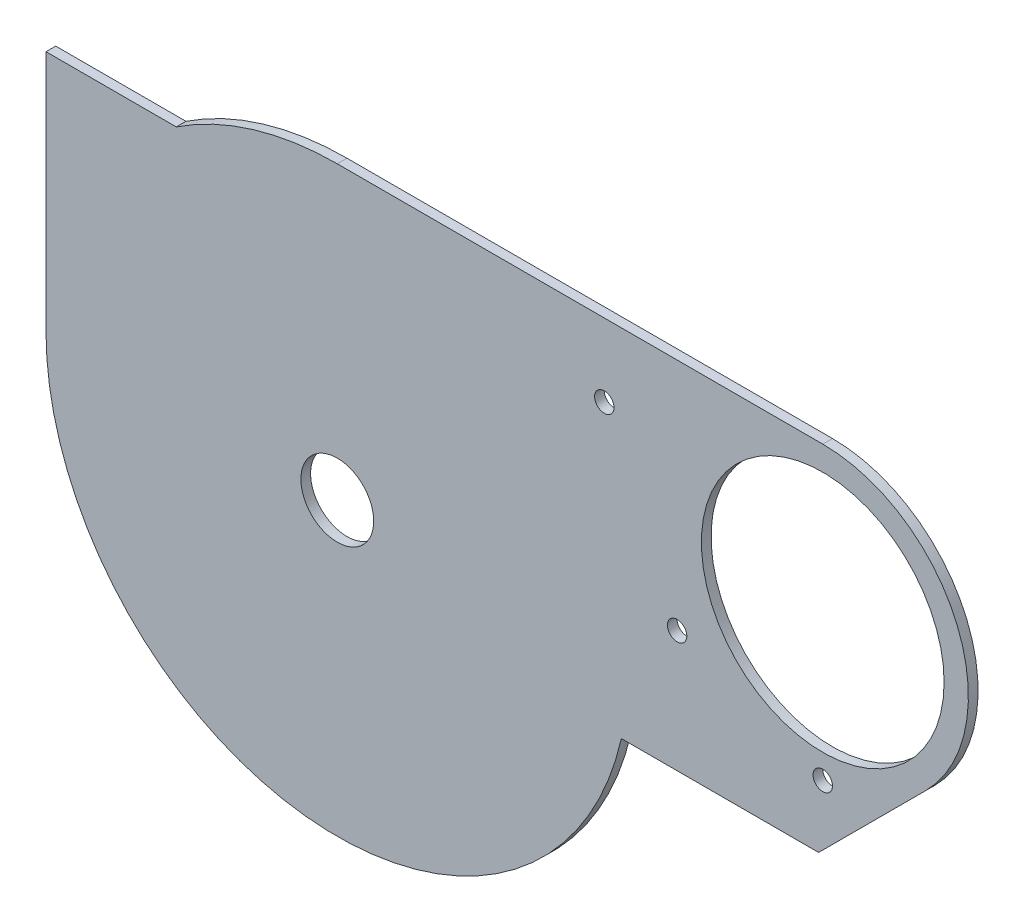
ISO-10303-21;
HEADER;
FILE_DESCRIPTION(('STEP AP214'),'2;1');
FILE_NAME('part.step','',(''),(''),'','','');
FILE_SCHEMA(('AUTOMOTIVE_DESIGN { 1 0 10303 214 1 1 1 1 }'));
ENDSEC;
DATA;
#1=APPLICATION_CONTEXT('core data for automotive mechanical design processes');
#2=APPLICATION_PROTOCOL_DEFINITION('international standard','automotive_design',2000,#1);
#3=PRODUCT_CONTEXT('',#1,'mechanical');
#4=PRODUCT('Part','Part','',(#3));
#5=PRODUCT_RELATED_PRODUCT_CATEGORY('part','',(#4));
#6=PRODUCT_DEFINITION_FORMATION('','',#4);
#7=PRODUCT_DEFINITION_CONTEXT('part definition',#1,'design');
#8=PRODUCT_DEFINITION('design','',#6,#7);
#9=PRODUCT_DEFINITION_SHAPE('','',#8);
#10=(LENGTH_UNIT() NAMED_UNIT(*) SI_UNIT(.MILLI.,.METRE.));
#11=(NAMED_UNIT(*) PLANE_ANGLE_UNIT() SI_UNIT($,.RADIAN.));
#12=(NAMED_UNIT(*) SI_UNIT($,.STERADIAN.) SOLID_ANGLE_UNIT());
#13=UNCERTAINTY_MEASURE_WITH_UNIT(LENGTH_MEASURE(1.E-05),#10,'distance_accuracy_value','');
#14=(GEOMETRIC_REPRESENTATION_CONTEXT(3) GLOBAL_UNCERTAINTY_ASSIGNED_CONTEXT((#13)) GLOBAL_UNIT_ASSIGNED_CONTEXT((#10,
#11,#12)) REPRESENTATION_CONTEXT('',''));
#15=CARTESIAN_POINT('',(0.,0.,0.));
#16=DIRECTION('',(0.,0.,1.));
#17=DIRECTION('',(1.,0.,0.));
#18=AXIS2_PLACEMENT_3D('',#15,#16,#17);
#19=CARTESIAN_POINT('',(-60.,0.,2.));
#20=DIRECTION('',(-1.,0.,0.));
#21=DIRECTION('',(0.,0.,1.));
#22=AXIS2_PLACEMENT_3D('',#19,#20,#21);
#23=PLANE('',#22);
#24=DIRECTION('',(0.,1.,0.));
#25=VECTOR('',#24,1.);
#26=CARTESIAN_POINT('',(-60.,0.,0.));
#27=LINE('',#26,#25);
#28=CARTESIAN_POINT('',(-60.,0.,0.));
#29=VERTEX_POINT('',#28);
#30=CARTESIAN_POINT('',(-60.,50.,0.));
#31=VERTEX_POINT('',#30);
#32=EDGE_CURVE('E153',#29,#31,#27,.T.);
#33=ORIENTED_EDGE('',*,*,#32,.F.);
#34=DIRECTION('',(0.,0.,-1.));
#35=VECTOR('',#34,1.);
#36=CARTESIAN_POINT('',(-60.,0.,2.));
#37=LINE('',#36,#35);
#38=CARTESIAN_POINT('',(-60.,0.,2.));
#39=VERTEX_POINT('',#38);
#40=EDGE_CURVE('E11',#39,#29,#37,.T.);
#41=ORIENTED_EDGE('',*,*,#40,.F.);
#42=DIRECTION('',(0.,1.,0.));
#43=VECTOR('',#42,1.);
#44=CARTESIAN_POINT('',(-60.,0.,2.));
#45=LINE('',#44,#43);
#46=CARTESIAN_POINT('',(-60.,50.,2.));
#47=VERTEX_POINT('',#46);
#48=EDGE_CURVE('E135',#39,#47,#45,.T.);
#49=ORIENTED_EDGE('',*,*,#48,.T.);
#50=DIRECTION('',(0.,0.,-1.));
#51=VECTOR('',#50,1.);
#52=CARTESIAN_POINT('',(-60.,50.,2.));
#53=LINE('',#52,#51);
#54=EDGE_CURVE('E89',#47,#31,#53,.T.);
#55=ORIENTED_EDGE('',*,*,#54,.T.);
#56=EDGE_LOOP('',(#33,#41,#49,#55));
#57=FACE_BOUND('',#56,.T.);
#58=ADVANCED_FACE('F37',(#57),#23,.T.);
#59=CARTESIAN_POINT('',(0.,0.,2.));
#60=DIRECTION('',(0.,0.,-1.));
#61=DIRECTION('',(-1.,0.,0.));
#62=AXIS2_PLACEMENT_3D('',#59,#60,#61);
#63=CYLINDRICAL_SURFACE('',#62,60.);
#64=CARTESIAN_POINT('',(0.,0.,0.));
#65=DIRECTION('',(0.,0.,1.));
#66=DIRECTION('',(1.,0.,0.));
#67=AXIS2_PLACEMENT_3D('',#64,#65,#66);
#68=CIRCLE('',#67,60.);
#69=CARTESIAN_POINT('',(58.5132004184799,-13.2742373335269,0.));
#70=VERTEX_POINT('',#69);
#71=EDGE_CURVE('E188',#29,#70,#68,.T.);
#72=ORIENTED_EDGE('',*,*,#71,.T.);
#73=DIRECTION('',(0.,0.,-1.));
#74=VECTOR('',#73,1.);
#75=CARTESIAN_POINT('',(58.5132004184799,-13.2742373335269,2.));
#76=LINE('',#75,#74);
#77=CARTESIAN_POINT('',(58.5132004184799,-13.2742373335269,2.));
#78=VERTEX_POINT('',#77);
#79=EDGE_CURVE('E46',#78,#70,#76,.T.);
#80=ORIENTED_EDGE('',*,*,#79,.F.);
#81=CARTESIAN_POINT('',(0.,0.,2.));
#82=DIRECTION('',(0.,0.,1.));
#83=DIRECTION('',(1.,0.,0.));
#84=AXIS2_PLACEMENT_3D('',#81,#82,#83);
#85=CIRCLE('',#84,60.);
#86=EDGE_CURVE('E129',#39,#78,#85,.T.);
#87=ORIENTED_EDGE('',*,*,#86,.F.);
#88=ORIENTED_EDGE('',*,*,#40,.T.);
#89=EDGE_LOOP('',(#72,#80,#87,#88));
#90=FACE_BOUND('',#89,.T.);
#91=ADVANCED_FACE('F177',(#90),#63,.T.);
#92=CARTESIAN_POINT('',(0.,-13.2742373335269,2.));
#93=DIRECTION('',(0.,1.,0.));
#94=DIRECTION('',(-1.,0.,0.));
#95=AXIS2_PLACEMENT_3D('',#92,#93,#94);
#96=PLANE('',#95);
#97=DIRECTION('',(1.,0.,0.));
#98=VECTOR('',#97,1.);
#99=CARTESIAN_POINT('',(0.,-13.2742373335269,0.));
#100=LINE('',#99,#98);
#101=CARTESIAN_POINT('',(99.1521695376659,-13.2742373335269,0.));
#102=VERTEX_POINT('',#101);
#103=EDGE_CURVE('E190',#70,#102,#100,.T.);
#104=ORIENTED_EDGE('',*,*,#103,.T.);
#105=DIRECTION('',(0.,0.,-1.));
#106=VECTOR('',#105,1.);
#107=CARTESIAN_POINT('',(99.1521695376659,-13.2742373335269,2.));
#108=LINE('',#107,#106);
#109=CARTESIAN_POINT('',(99.1521695376659,-13.2742373335269,2.));
#110=VERTEX_POINT('',#109);
#111=EDGE_CURVE('E212',#110,#102,#108,.T.);
#112=ORIENTED_EDGE('',*,*,#111,.F.);
#113=DIRECTION('',(1.,0.,0.));
#114=VECTOR('',#113,1.);
#115=CARTESIAN_POINT('',(0.,-13.2742373335269,2.));
#116=LINE('',#115,#114);
#117=EDGE_CURVE('E134',#78,#110,#116,.T.);
#118=ORIENTED_EDGE('',*,*,#117,.F.);
#119=ORIENTED_EDGE('',*,*,#79,.T.);
#120=EDGE_LOOP('',(#104,#112,#118,#119));
#121=FACE_BOUND('',#120,.T.);
#122=ADVANCED_FACE('F181',(#121),#96,.F.);
#123=CARTESIAN_POINT('',(56.2132034355964,-56.2132034355964,2.));
#124=DIRECTION('',(-0.707106781186548,0.707106781186547,0.));
#125=DIRECTION('',(-0.707106781186547,-0.707106781186548,0.));
#126=AXIS2_PLACEMENT_3D('',#123,#124,#125);
#127=PLANE('',#126);
#128=DIRECTION('',(0.707106781186547,0.707106781186548,0.));
#129=VECTOR('',#128,1.);
#130=CARTESIAN_POINT('',(56.2132034355964,-56.2132034355964,0.));
#131=LINE('',#130,#129);
#132=CARTESIAN_POINT('',(121.213203435596,8.7867965644036,0.));
#133=VERTEX_POINT('',#132);
#134=EDGE_CURVE('E197',#102,#133,#131,.T.);
#135=ORIENTED_EDGE('',*,*,#134,.T.);
#136=DIRECTION('',(0.,0.,-1.));
#137=VECTOR('',#136,1.);
#138=CARTESIAN_POINT('',(121.213203435596,8.7867965644036,2.));
#139=LINE('',#138,#137);
#140=CARTESIAN_POINT('',(121.213203435596,8.7867965644036,2.));
#141=VERTEX_POINT('',#140);
#142=EDGE_CURVE('E209',#141,#133,#139,.T.);
#143=ORIENTED_EDGE('',*,*,#142,.F.);
#144=DIRECTION('',(0.707106781186547,0.707106781186548,0.));
#145=VECTOR('',#144,1.);
#146=CARTESIAN_POINT('',(56.2132034355964,-56.2132034355964,2.));
#147=LINE('',#146,#145);
#148=EDGE_CURVE('E137',#110,#141,#147,.T.);
#149=ORIENTED_EDGE('',*,*,#148,.F.);
#150=ORIENTED_EDGE('',*,*,#111,.T.);
#151=EDGE_LOOP('',(#135,#143,#149,#150));
#152=FACE_BOUND('',#151,.T.);
#153=ADVANCED_FACE('F225',(#152),#127,.F.);
#154=CARTESIAN_POINT('',(100.,30.,2.));
#155=DIRECTION('',(0.,0.,-1.));
#156=DIRECTION('',(-1.,0.,0.));
#157=AXIS2_PLACEMENT_3D('',#154,#155,#156);
#158=CYLINDRICAL_SURFACE('',#157,30.);
#159=CARTESIAN_POINT('',(100.,30.,0.));
#160=DIRECTION('',(0.,0.,1.));
#161=DIRECTION('',(1.,0.,0.));
#162=AXIS2_PLACEMENT_3D('',#159,#160,#161);
#163=CIRCLE('',#162,30.);
#164=CARTESIAN_POINT('',(100.,60.,0.));
#165=VERTEX_POINT('',#164);
#166=EDGE_CURVE('E199',#133,#165,#163,.T.);
#167=ORIENTED_EDGE('',*,*,#166,.T.);
#168=DIRECTION('',(0.,0.,-1.));
#169=VECTOR('',#168,1.);
#170=CARTESIAN_POINT('',(100.,60.,2.));
#171=LINE('',#170,#169);
#172=CARTESIAN_POINT('',(100.,60.,2.));
#173=VERTEX_POINT('',#172);
#174=EDGE_CURVE('E124',#173,#165,#171,.T.);
#175=ORIENTED_EDGE('',*,*,#174,.F.);
#176=CARTESIAN_POINT('',(100.,30.,2.));
#177=DIRECTION('',(0.,0.,1.));
#178=DIRECTION('',(1.,0.,0.));
#179=AXIS2_PLACEMENT_3D('',#176,#177,#178);
#180=CIRCLE('',#179,30.);
#181=EDGE_CURVE('E115',#141,#173,#180,.T.);
#182=ORIENTED_EDGE('',*,*,#181,.F.);
#183=ORIENTED_EDGE('',*,*,#142,.T.);
#184=EDGE_LOOP('',(#167,#175,#182,#183));
#185=FACE_BOUND('',#184,.T.);
#186=ADVANCED_FACE('F228',(#185),#158,.T.);
#187=CARTESIAN_POINT('',(0.,60.,2.));
#188=DIRECTION('',(0.,-1.,0.));
#189=DIRECTION('',(0.,0.,-1.));
#190=AXIS2_PLACEMENT_3D('',#187,#188,#189);
#191=PLANE('',#190);
#192=DIRECTION('',(-1.,0.,0.));
#193=VECTOR('',#192,1.);
#194=CARTESIAN_POINT('',(0.,60.,0.));
#195=LINE('',#194,#193);
#196=CARTESIAN_POINT('',(0.,60.,0.));
#197=VERTEX_POINT('',#196);
#198=EDGE_CURVE('E123',#165,#197,#195,.T.);
#199=ORIENTED_EDGE('',*,*,#198,.T.);
#200=DIRECTION('',(0.,0.,-1.));
#201=VECTOR('',#200,1.);
#202=CARTESIAN_POINT('',(0.,60.,2.));
#203=LINE('',#202,#201);
#204=CARTESIAN_POINT('',(0.,60.,2.));
#205=VERTEX_POINT('',#204);
#206=EDGE_CURVE('E120',#205,#197,#203,.T.);
#207=ORIENTED_EDGE('',*,*,#206,.F.);
#208=DIRECTION('',(-1.,0.,0.));
#209=VECTOR('',#208,1.);
#210=CARTESIAN_POINT('',(0.,60.,2.));
#211=LINE('',#210,#209);
#212=EDGE_CURVE('E108',#173,#205,#211,.T.);
#213=ORIENTED_EDGE('',*,*,#212,.F.);
#214=ORIENTED_EDGE('',*,*,#174,.T.);
#215=EDGE_LOOP('',(#199,#207,#213,#214));
#216=FACE_BOUND('',#215,.T.);
#217=ADVANCED_FACE('F121',(#216),#191,.F.);
#218=CARTESIAN_POINT('',(-33.166247903554,50.,0.));
#219=VERTEX_POINT('',#218);
#220=EDGE_CURVE('E82',#197,#219,#68,.T.);
#221=ORIENTED_EDGE('',*,*,#220,.T.);
#222=DIRECTION('',(0.,0.,-1.));
#223=VECTOR('',#222,1.);
#224=CARTESIAN_POINT('',(-33.166247903554,50.,2.));
#225=LINE('',#224,#223);
#226=CARTESIAN_POINT('',(-33.166247903554,50.,2.));
#227=VERTEX_POINT('',#226);
#228=EDGE_CURVE('E125',#227,#219,#225,.T.);
#229=ORIENTED_EDGE('',*,*,#228,.F.);
#230=EDGE_CURVE('E113',#205,#227,#85,.T.);
#231=ORIENTED_EDGE('',*,*,#230,.F.);
#232=ORIENTED_EDGE('',*,*,#206,.T.);
#233=EDGE_LOOP('',(#221,#229,#231,#232));
#234=FACE_BOUND('',#233,.T.);
#235=ADVANCED_FACE('F127',(#234),#63,.T.);
#236=CARTESIAN_POINT('',(100.,30.,2.));
#237=DIRECTION('',(0.,0.,-1.));
#238=DIRECTION('',(-1.,0.,0.));
#239=AXIS2_PLACEMENT_3D('',#236,#237,#238);
#240=CYLINDRICAL_SURFACE('',#239,25.);
#241=CARTESIAN_POINT('',(100.,30.,2.));
#242=DIRECTION('',(0.,0.,1.));
#243=DIRECTION('',(1.,0.,0.));
#244=AXIS2_PLACEMENT_3D('',#241,#242,#243);
#245=CIRCLE('',#244,25.);
#246=CARTESIAN_POINT('',(125.,30.,2.));
#247=VERTEX_POINT('',#246);
#248=EDGE_CURVE('E130',#247,#247,#245,.T.);
#249=ORIENTED_EDGE('',*,*,#248,.T.);
#250=EDGE_LOOP('',(#249));
#251=FACE_BOUND('',#250,.T.);
#252=CARTESIAN_POINT('',(100.,30.,0.));
#253=DIRECTION('',(0.,0.,1.));
#254=DIRECTION('',(1.,0.,0.));
#255=AXIS2_PLACEMENT_3D('',#252,#253,#254);
#256=CIRCLE('',#255,25.);
#257=CARTESIAN_POINT('',(125.,30.,0.));
#258=VERTEX_POINT('',#257);
#259=EDGE_CURVE('E140',#258,#258,#256,.T.);
#260=ORIENTED_EDGE('',*,*,#259,.F.);
#261=EDGE_LOOP('',(#260));
#262=FACE_BOUND('',#261,.T.);
#263=ADVANCED_FACE('F254',(#251,#262),#240,.F.);
#264=CARTESIAN_POINT('',(0.,50.,2.));
#265=DIRECTION('',(0.,-1.,0.));
#266=DIRECTION('',(0.,0.,-1.));
#267=AXIS2_PLACEMENT_3D('',#264,#265,#266);
#268=PLANE('',#267);
#269=DIRECTION('',(-1.,0.,0.));
#270=VECTOR('',#269,1.);
#271=CARTESIAN_POINT('',(0.,50.,0.));
#272=LINE('',#271,#270);
#273=EDGE_CURVE('E202',#219,#31,#272,.T.);
#274=ORIENTED_EDGE('',*,*,#273,.T.);
#275=ORIENTED_EDGE('',*,*,#54,.F.);
#276=DIRECTION('',(-1.,0.,0.));
#277=VECTOR('',#276,1.);
#278=CARTESIAN_POINT('',(0.,50.,2.));
#279=LINE('',#278,#277);
#280=EDGE_CURVE('E54',#227,#47,#279,.T.);
#281=ORIENTED_EDGE('',*,*,#280,.F.);
#282=ORIENTED_EDGE('',*,*,#228,.T.);
#283=EDGE_LOOP('',(#274,#275,#281,#282));
#284=FACE_BOUND('',#283,.T.);
#285=ADVANCED_FACE('F249',(#284),#268,.F.);
#286=CARTESIAN_POINT('',(0.,0.,2.));
#287=DIRECTION('',(0.,0.,-1.));
#288=DIRECTION('',(-1.,0.,0.));
#289=AXIS2_PLACEMENT_3D('',#286,#287,#288);
#290=CYLINDRICAL_SURFACE('',#289,7.5);
#291=CARTESIAN_POINT('',(0.,0.,2.));
#292=DIRECTION('',(0.,0.,1.));
#293=DIRECTION('',(1.,0.,0.));
#294=AXIS2_PLACEMENT_3D('',#291,#292,#293);
#295=CIRCLE('',#294,7.5);
#296=CARTESIAN_POINT('',(7.5,0.,2.));
#297=VERTEX_POINT('',#296);
#298=EDGE_CURVE('E193',#297,#297,#295,.T.);
#299=ORIENTED_EDGE('',*,*,#298,.T.);
#300=EDGE_LOOP('',(#299));
#301=FACE_BOUND('',#300,.T.);
#302=CARTESIAN_POINT('',(0.,0.,0.));
#303=DIRECTION('',(0.,0.,1.));
#304=DIRECTION('',(1.,0.,0.));
#305=AXIS2_PLACEMENT_3D('',#302,#303,#304);
#306=CIRCLE('',#305,7.5);
#307=CARTESIAN_POINT('',(7.5,0.,0.));
#308=VERTEX_POINT('',#307);
#309=EDGE_CURVE('E138',#308,#308,#306,.T.);
#310=ORIENTED_EDGE('',*,*,#309,.F.);
#311=EDGE_LOOP('',(#310));
#312=FACE_BOUND('',#311,.T.);
#313=ADVANCED_FACE('F237',(#301,#312),#290,.F.);
#314=CARTESIAN_POINT('',(0.,0.,2.));
#315=DIRECTION('',(0.,0.,1.));
#316=DIRECTION('',(1.,0.,0.));
#317=AXIS2_PLACEMENT_3D('',#314,#315,#316);
#318=PLANE('',#317);
#319=CARTESIAN_POINT('',(100.,0.,2.));
#320=DIRECTION('',(0.,0.,1.));
#321=DIRECTION('',(1.,0.,0.));
#322=AXIS2_PLACEMENT_3D('',#319,#320,#321);
#323=CIRCLE('',#322,2.);
#324=CARTESIAN_POINT('',(102.,0.,2.));
#325=VERTEX_POINT('',#324);
#326=EDGE_CURVE('E156',#325,#325,#323,.T.);
#327=ORIENTED_EDGE('',*,*,#326,.F.);
#328=EDGE_LOOP('',(#327));
#329=FACE_BOUND('',#328,.T.);
#330=CARTESIAN_POINT('',(55.,45.,2.));
#331=DIRECTION('',(0.,0.,1.));
#332=DIRECTION('',(1.,0.,0.));
#333=AXIS2_PLACEMENT_3D('',#330,#331,#332);
#334=CIRCLE('',#333,2.);
#335=CARTESIAN_POINT('',(57.,45.,2.));
#336=VERTEX_POINT('',#335);
#337=EDGE_CURVE('E146',#336,#336,#334,.T.);
#338=ORIENTED_EDGE('',*,*,#337,.F.);
#339=EDGE_LOOP('',(#338));
#340=FACE_BOUND('',#339,.T.);
#341=CARTESIAN_POINT('',(70.,11.7257626664731,2.));
#342=DIRECTION('',(0.,0.,1.));
#343=DIRECTION('',(1.,0.,0.));
#344=AXIS2_PLACEMENT_3D('',#341,#342,#343);
#345=CIRCLE('',#344,2.);
#346=CARTESIAN_POINT('',(72.,11.7257626664731,2.));
#347=VERTEX_POINT('',#346);
#348=EDGE_CURVE('E143',#347,#347,#345,.T.);
#349=ORIENTED_EDGE('',*,*,#348,.F.);
#350=EDGE_LOOP('',(#349));
#351=FACE_BOUND('',#350,.T.);
#352=ORIENTED_EDGE('',*,*,#48,.F.);
#353=ORIENTED_EDGE('',*,*,#86,.T.);
#354=ORIENTED_EDGE('',*,*,#117,.T.);
#355=ORIENTED_EDGE('',*,*,#148,.T.);
#356=ORIENTED_EDGE('',*,*,#181,.T.);
#357=ORIENTED_EDGE('',*,*,#212,.T.);
#358=ORIENTED_EDGE('',*,*,#230,.T.);
#359=ORIENTED_EDGE('',*,*,#280,.T.);
#360=EDGE_LOOP('',(#352,#353,#354,#355,#356,#357,#358,#359));
#361=FACE_BOUND('',#360,.T.);
#362=ORIENTED_EDGE('',*,*,#248,.F.);
#363=EDGE_LOOP('',(#362));
#364=FACE_BOUND('',#363,.T.);
#365=ORIENTED_EDGE('',*,*,#298,.F.);
#366=EDGE_LOOP('',(#365));
#367=FACE_BOUND('',#366,.T.);
#368=ADVANCED_FACE('F110',(#329,#340,#351,#361,#364,#367),#318,.T.);
#369=CARTESIAN_POINT('',(0.,0.,0.));
#370=DIRECTION('',(0.,0.,1.));
#371=DIRECTION('',(1.,0.,0.));
#372=AXIS2_PLACEMENT_3D('',#369,#370,#371);
#373=PLANE('',#372);
#374=CARTESIAN_POINT('',(100.,0.,0.));
#375=DIRECTION('',(0.,0.,1.));
#376=DIRECTION('',(1.,0.,0.));
#377=AXIS2_PLACEMENT_3D('',#374,#375,#376);
#378=CIRCLE('',#377,2.);
#379=CARTESIAN_POINT('',(102.,0.,0.));
#380=VERTEX_POINT('',#379);
#381=EDGE_CURVE('E40',#380,#380,#378,.T.);
#382=ORIENTED_EDGE('',*,*,#381,.T.);
#383=EDGE_LOOP('',(#382));
#384=FACE_BOUND('',#383,.T.);
#385=CARTESIAN_POINT('',(55.,45.,0.));
#386=DIRECTION('',(0.,0.,1.));
#387=DIRECTION('',(1.,0.,0.));
#388=AXIS2_PLACEMENT_3D('',#385,#386,#387);
#389=CIRCLE('',#388,2.);
#390=CARTESIAN_POINT('',(57.,45.,0.));
#391=VERTEX_POINT('',#390);
#392=EDGE_CURVE('E150',#391,#391,#389,.F.);
#393=ORIENTED_EDGE('',*,*,#392,.F.);
#394=EDGE_LOOP('',(#393));
#395=FACE_BOUND('',#394,.T.);
#396=CARTESIAN_POINT('',(70.,11.7257626664731,0.));
#397=DIRECTION('',(0.,0.,1.));
#398=DIRECTION('',(1.,0.,0.));
#399=AXIS2_PLACEMENT_3D('',#396,#397,#398);
#400=CIRCLE('',#399,2.);
#401=CARTESIAN_POINT('',(72.,11.7257626664731,0.));
#402=VERTEX_POINT('',#401);
#403=EDGE_CURVE('E147',#402,#402,#400,.F.);
#404=ORIENTED_EDGE('',*,*,#403,.F.);
#405=EDGE_LOOP('',(#404));
#406=FACE_BOUND('',#405,.T.);
#407=ORIENTED_EDGE('',*,*,#32,.T.);
#408=ORIENTED_EDGE('',*,*,#273,.F.);
#409=ORIENTED_EDGE('',*,*,#220,.F.);
#410=ORIENTED_EDGE('',*,*,#198,.F.);
#411=ORIENTED_EDGE('',*,*,#166,.F.);
#412=ORIENTED_EDGE('',*,*,#134,.F.);
#413=ORIENTED_EDGE('',*,*,#103,.F.);
#414=ORIENTED_EDGE('',*,*,#71,.F.);
#415=EDGE_LOOP('',(#407,#408,#409,#410,#411,#412,#413,#414));
#416=FACE_BOUND('',#415,.T.);
#417=ORIENTED_EDGE('',*,*,#259,.T.);
#418=EDGE_LOOP('',(#417));
#419=FACE_BOUND('',#418,.T.);
#420=ORIENTED_EDGE('',*,*,#309,.T.);
#421=EDGE_LOOP('',(#420));
#422=FACE_BOUND('',#421,.T.);
#423=ADVANCED_FACE('F163',(#384,#395,#406,#416,#419,#422),#373,.F.);
#424=CARTESIAN_POINT('',(70.,11.7257626664731,-0.00100000000000013));
#425=DIRECTION('',(0.,0.,1.));
#426=DIRECTION('',(1.,0.,0.));
#427=AXIS2_PLACEMENT_3D('',#424,#425,#426);
#428=CYLINDRICAL_SURFACE('',#427,2.);
#429=ORIENTED_EDGE('',*,*,#348,.T.);
#430=EDGE_LOOP('',(#429));
#431=FACE_BOUND('',#430,.T.);
#432=ORIENTED_EDGE('',*,*,#403,.T.);
#433=EDGE_LOOP('',(#432));
#434=FACE_BOUND('',#433,.T.);
#435=ADVANCED_FACE('F173',(#431,#434),#428,.F.);
#436=CARTESIAN_POINT('',(55.,45.,-0.00100000000000013));
#437=DIRECTION('',(0.,0.,1.));
#438=DIRECTION('',(1.,0.,0.));
#439=AXIS2_PLACEMENT_3D('',#436,#437,#438);
#440=CYLINDRICAL_SURFACE('',#439,2.);
#441=ORIENTED_EDGE('',*,*,#337,.T.);
#442=EDGE_LOOP('',(#441));
#443=FACE_BOUND('',#442,.T.);
#444=ORIENTED_EDGE('',*,*,#392,.T.);
#445=EDGE_LOOP('',(#444));
#446=FACE_BOUND('',#445,.T.);
#447=ADVANCED_FACE('F168',(#443,#446),#440,.F.);
#448=CARTESIAN_POINT('',(100.,0.,-8.));
#449=DIRECTION('',(0.,0.,1.));
#450=DIRECTION('',(1.,0.,0.));
#451=AXIS2_PLACEMENT_3D('',#448,#449,#450);
#452=CYLINDRICAL_SURFACE('',#451,2.);
#453=ORIENTED_EDGE('',*,*,#326,.T.);
#454=EDGE_LOOP('',(#453));
#455=FACE_BOUND('',#454,.T.);
#456=ORIENTED_EDGE('',*,*,#381,.F.);
#457=EDGE_LOOP('',(#456));
#458=FACE_BOUND('',#457,.T.);
#459=ADVANCED_FACE('F166',(#455,#458),#452,.F.);
#460=CLOSED_SHELL('',(#58,#91,#122,#153,#186,#217,#235,#263,#285,#313,#368,#423,#435,#447,#459));
#461=MANIFOLD_SOLID_BREP('B2',#460);
#462=ADVANCED_BREP_SHAPE_REPRESENTATION('',(#18,#461),#14);
#463=SHAPE_DEFINITION_REPRESENTATION(#9,#462);
ENDSEC;
END-ISO-10303-21;
